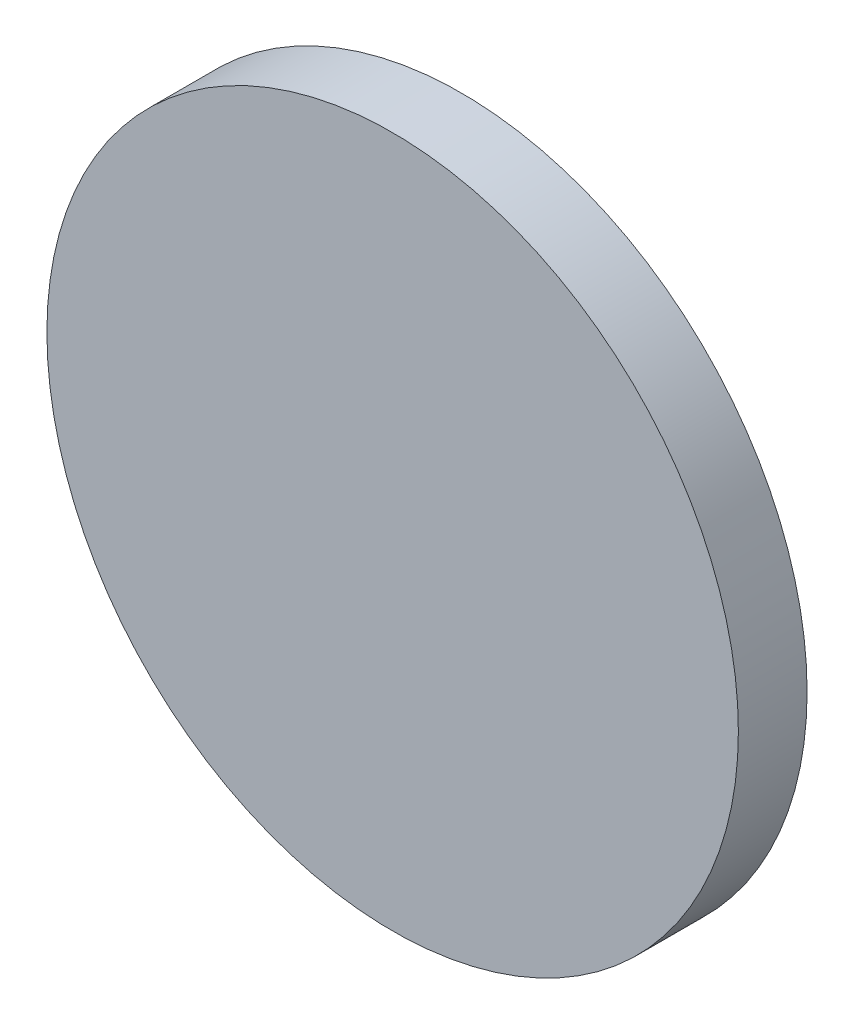
ISO-10303-21;
HEADER;
FILE_DESCRIPTION(('STEP AP214'),'2;1');
FILE_NAME('part.step','',(''),(''),'','','');
FILE_SCHEMA(('AUTOMOTIVE_DESIGN { 1 0 10303 214 1 1 1 1 }'));
ENDSEC;
DATA;
#1=APPLICATION_CONTEXT('core data for automotive mechanical design processes');
#2=APPLICATION_PROTOCOL_DEFINITION('international standard','automotive_design',2000,#1);
#3=PRODUCT_CONTEXT('',#1,'mechanical');
#4=PRODUCT('Part','Part','',(#3));
#5=PRODUCT_RELATED_PRODUCT_CATEGORY('part','',(#4));
#6=PRODUCT_DEFINITION_FORMATION('','',#4);
#7=PRODUCT_DEFINITION_CONTEXT('part definition',#1,'design');
#8=PRODUCT_DEFINITION('design','',#6,#7);
#9=PRODUCT_DEFINITION_SHAPE('','',#8);
#10=(LENGTH_UNIT() NAMED_UNIT(*) SI_UNIT(.MILLI.,.METRE.));
#11=(NAMED_UNIT(*) PLANE_ANGLE_UNIT() SI_UNIT($,.RADIAN.));
#12=(NAMED_UNIT(*) SI_UNIT($,.STERADIAN.) SOLID_ANGLE_UNIT());
#13=UNCERTAINTY_MEASURE_WITH_UNIT(LENGTH_MEASURE(1.E-05),#10,'distance_accuracy_value','');
#14=(GEOMETRIC_REPRESENTATION_CONTEXT(3) GLOBAL_UNCERTAINTY_ASSIGNED_CONTEXT((#13)) GLOBAL_UNIT_ASSIGNED_CONTEXT((#10,
#11,#12)) REPRESENTATION_CONTEXT('',''));
#15=CARTESIAN_POINT('',(0.,0.,0.));
#16=DIRECTION('',(0.,0.,1.));
#17=DIRECTION('',(1.,0.,0.));
#18=AXIS2_PLACEMENT_3D('',#15,#16,#17);
#19=CARTESIAN_POINT('',(-55.6084796783125,37.6380657405662,20.));
#20=DIRECTION('',(0.,0.,-1.));
#21=DIRECTION('',(-1.,0.,0.));
#22=AXIS2_PLACEMENT_3D('',#19,#20,#21);
#23=CYLINDRICAL_SURFACE('',#22,100.623377409328);
#24=CARTESIAN_POINT('',(-55.6084796783125,37.6380657405662,20.));
#25=DIRECTION('',(0.,0.,1.));
#26=DIRECTION('',(1.,0.,0.));
#27=AXIS2_PLACEMENT_3D('',#24,#25,#26);
#28=CIRCLE('',#27,100.623377409328);
#29=CARTESIAN_POINT('',(45.0148977310151,37.6380657405662,20.));
#30=VERTEX_POINT('',#29);
#31=EDGE_CURVE('E10',#30,#30,#28,.T.);
#32=ORIENTED_EDGE('',*,*,#31,.F.);
#33=EDGE_LOOP('',(#32));
#34=FACE_BOUND('',#33,.T.);
#35=CARTESIAN_POINT('',(-55.6084796783125,37.6380657405662,0.));
#36=DIRECTION('',(0.,0.,1.));
#37=DIRECTION('',(1.,0.,0.));
#38=AXIS2_PLACEMENT_3D('',#35,#36,#37);
#39=CIRCLE('',#38,100.623377409328);
#40=CARTESIAN_POINT('',(45.0148977310151,37.6380657405662,0.));
#41=VERTEX_POINT('',#40);
#42=EDGE_CURVE('E36',#41,#41,#39,.T.);
#43=ORIENTED_EDGE('',*,*,#42,.T.);
#44=EDGE_LOOP('',(#43));
#45=FACE_BOUND('',#44,.T.);
#46=ADVANCED_FACE('F33',(#34,#45),#23,.T.);
#47=CARTESIAN_POINT('',(-55.6084796783125,37.6380657405662,20.));
#48=DIRECTION('',(0.,0.,1.));
#49=DIRECTION('',(1.,0.,0.));
#50=AXIS2_PLACEMENT_3D('',#47,#48,#49);
#51=PLANE('',#50);
#52=ORIENTED_EDGE('',*,*,#31,.T.);
#53=EDGE_LOOP('',(#52));
#54=FACE_BOUND('',#53,.T.);
#55=ADVANCED_FACE('F48',(#54),#51,.T.);
#56=CARTESIAN_POINT('',(-55.6084796783125,37.6380657405662,0.));
#57=DIRECTION('',(0.,0.,1.));
#58=DIRECTION('',(1.,0.,0.));
#59=AXIS2_PLACEMENT_3D('',#56,#57,#58);
#60=PLANE('',#59);
#61=ORIENTED_EDGE('',*,*,#42,.F.);
#62=EDGE_LOOP('',(#61));
#63=FACE_BOUND('',#62,.T.);
#64=ADVANCED_FACE('F46',(#63),#60,.F.);
#65=CLOSED_SHELL('',(#46,#55,#64));
#66=MANIFOLD_SOLID_BREP('B2',#65);
#67=ADVANCED_BREP_SHAPE_REPRESENTATION('',(#18,#66),#14);
#68=SHAPE_DEFINITION_REPRESENTATION(#9,#67);
ENDSEC;
END-ISO-10303-21;
